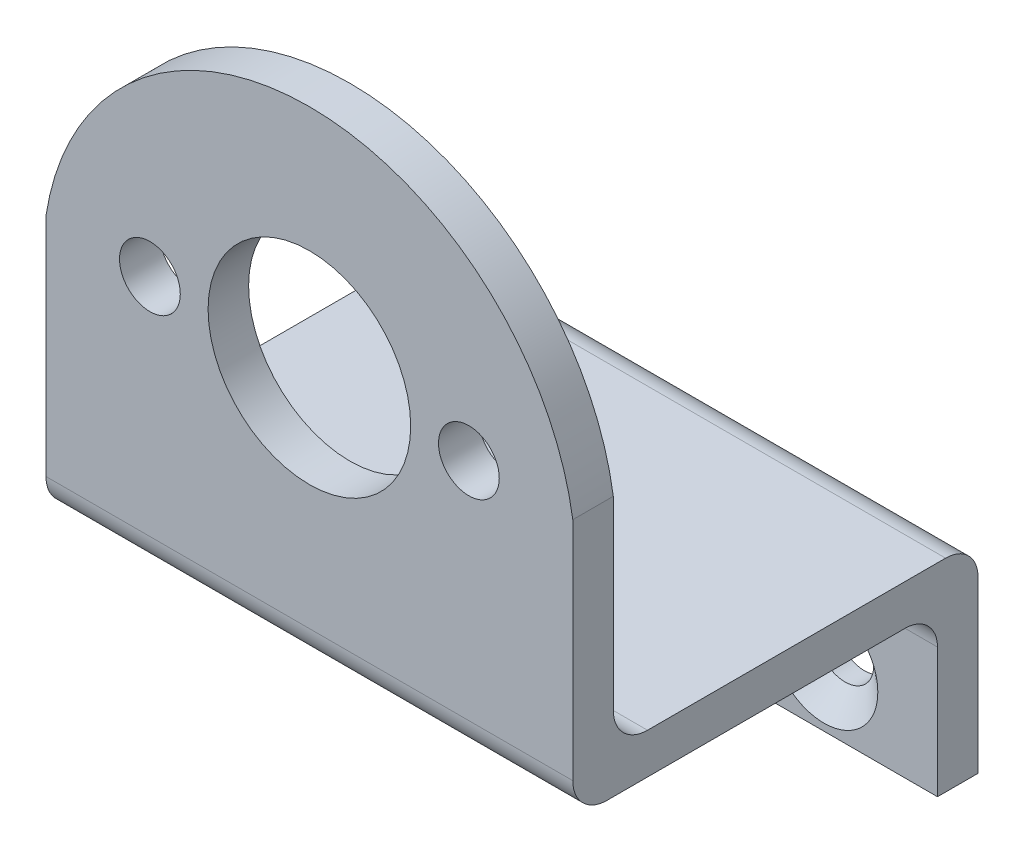
ISO-10303-21;
HEADER;
FILE_DESCRIPTION(('STEP AP214'),'2;1');
FILE_NAME('part.step','',(''),(''),'','','');
FILE_SCHEMA(('AUTOMOTIVE_DESIGN { 1 0 10303 214 1 1 1 1 }'));
ENDSEC;
DATA;
#1=APPLICATION_CONTEXT('core data for automotive mechanical design processes');
#2=APPLICATION_PROTOCOL_DEFINITION('international standard','automotive_design',2000,#1);
#3=PRODUCT_CONTEXT('',#1,'mechanical');
#4=PRODUCT('Part','Part','',(#3));
#5=PRODUCT_RELATED_PRODUCT_CATEGORY('part','',(#4));
#6=PRODUCT_DEFINITION_FORMATION('','',#4);
#7=PRODUCT_DEFINITION_CONTEXT('part definition',#1,'design');
#8=PRODUCT_DEFINITION('design','',#6,#7);
#9=PRODUCT_DEFINITION_SHAPE('','',#8);
#10=(LENGTH_UNIT() NAMED_UNIT(*) SI_UNIT(.MILLI.,.METRE.));
#11=(NAMED_UNIT(*) PLANE_ANGLE_UNIT() SI_UNIT($,.RADIAN.));
#12=(NAMED_UNIT(*) SI_UNIT($,.STERADIAN.) SOLID_ANGLE_UNIT());
#13=UNCERTAINTY_MEASURE_WITH_UNIT(LENGTH_MEASURE(1.E-05),#10,'distance_accuracy_value','');
#14=(GEOMETRIC_REPRESENTATION_CONTEXT(3) GLOBAL_UNCERTAINTY_ASSIGNED_CONTEXT((#13)) GLOBAL_UNIT_ASSIGNED_CONTEXT((#10,
#11,#12)) REPRESENTATION_CONTEXT('',''));
#15=CARTESIAN_POINT('',(0.,0.,0.));
#16=DIRECTION('',(0.,0.,1.));
#17=DIRECTION('',(1.,0.,0.));
#18=AXIS2_PLACEMENT_3D('',#15,#16,#17);
#19=CARTESIAN_POINT('',(41.275,42.094372260743,3.175));
#20=DIRECTION('',(0.,0.,-1.));
#21=DIRECTION('',(0.,1.,0.));
#22=AXIS2_PLACEMENT_3D('',#19,#20,#21);
#23=PLANE('',#22);
#24=CARTESIAN_POINT('',(8.14050126007641,24.314372260743,3.17499999999999));
#25=DIRECTION('',(0.,0.,1.));
#26=DIRECTION('',(1.,0.,0.));
#27=AXIS2_PLACEMENT_3D('',#24,#25,#26);
#28=CIRCLE('',#27,2.38125);
#29=CARTESIAN_POINT('',(10.5217512600764,24.314372260743,3.17499999999999));
#30=VERTEX_POINT('',#29);
#31=EDGE_CURVE('E249',#30,#30,#28,.T.);
#32=ORIENTED_EDGE('',*,*,#31,.F.);
#33=EDGE_LOOP('',(#32));
#34=FACE_BOUND('',#33,.T.);
#35=CARTESIAN_POINT('',(20.6375,24.3848505315544,3.17499999999999));
#36=DIRECTION('',(0.,0.,1.));
#37=DIRECTION('',(1.,0.,0.));
#38=AXIS2_PLACEMENT_3D('',#35,#36,#37);
#39=CIRCLE('',#38,7.9375);
#40=CARTESIAN_POINT('',(28.575,24.3848505315544,3.17499999999999));
#41=VERTEX_POINT('',#40);
#42=EDGE_CURVE('E246',#41,#41,#39,.T.);
#43=ORIENTED_EDGE('',*,*,#42,.F.);
#44=EDGE_LOOP('',(#43));
#45=FACE_BOUND('',#44,.T.);
#46=DIRECTION('',(0.,-1.,0.));
#47=VECTOR('',#46,1.);
#48=CARTESIAN_POINT('',(41.275,42.094372260743,3.175));
#49=LINE('',#48,#47);
#50=CARTESIAN_POINT('',(41.275,24.3848505315544,3.17499999999999));
#51=VERTEX_POINT('',#50);
#52=CARTESIAN_POINT('',(41.275,6.67532880236569,3.17499999999999));
#53=VERTEX_POINT('',#52);
#54=EDGE_CURVE('E146',#51,#53,#49,.T.);
#55=ORIENTED_EDGE('',*,*,#54,.F.);
#56=CARTESIAN_POINT('',(20.6375,21.2148257253978,3.17499999999999));
#57=DIRECTION('',(0.,0.,1.));
#58=DIRECTION('',(1.,0.,0.));
#59=AXIS2_PLACEMENT_3D('',#56,#57,#58);
#60=CIRCLE('',#59,20.8795465353453);
#61=CARTESIAN_POINT('',(0.,24.3848505315544,3.17499999999999));
#62=VERTEX_POINT('',#61);
#63=EDGE_CURVE('E253',#62,#51,#60,.F.);
#64=ORIENTED_EDGE('',*,*,#63,.F.);
#65=DIRECTION('',(0.,-1.,0.));
#66=VECTOR('',#65,1.);
#67=CARTESIAN_POINT('',(0.,42.094372260743,3.175));
#68=LINE('',#67,#66);
#69=CARTESIAN_POINT('',(0.,6.67532880236569,3.17499999999999));
#70=VERTEX_POINT('',#69);
#71=EDGE_CURVE('E201',#62,#70,#68,.T.);
#72=ORIENTED_EDGE('',*,*,#71,.T.);
#73=DIRECTION('',(-1.,0.,0.));
#74=VECTOR('',#73,1.);
#75=CARTESIAN_POINT('',(41.275,6.67532880236569,3.17499999999999));
#76=LINE('',#75,#74);
#77=EDGE_CURVE('E241',#53,#70,#76,.T.);
#78=ORIENTED_EDGE('',*,*,#77,.F.);
#79=EDGE_LOOP('',(#55,#64,#72,#78));
#80=FACE_BOUND('',#79,.T.);
#81=CARTESIAN_POINT('',(33.1341012600764,24.314372260743,3.17499999999999));
#82=DIRECTION('',(0.,0.,1.));
#83=DIRECTION('',(1.,0.,0.));
#84=AXIS2_PLACEMENT_3D('',#81,#82,#83);
#85=CIRCLE('',#84,2.38125);
#86=CARTESIAN_POINT('',(35.5153512600764,24.314372260743,3.17499999999999));
#87=VERTEX_POINT('',#86);
#88=EDGE_CURVE('E255',#87,#87,#85,.T.);
#89=ORIENTED_EDGE('',*,*,#88,.F.);
#90=EDGE_LOOP('',(#89));
#91=FACE_BOUND('',#90,.T.);
#92=ADVANCED_FACE('F75',(#34,#45,#80,#91),#23,.F.);
#93=CARTESIAN_POINT('',(41.275,42.094372260743,0.));
#94=DIRECTION('',(0.,0.,-1.));
#95=DIRECTION('',(0.,1.,0.));
#96=AXIS2_PLACEMENT_3D('',#93,#94,#95);
#97=PLANE('',#96);
#98=CARTESIAN_POINT('',(20.6375,24.3848505315544,0.));
#99=DIRECTION('',(0.,0.,-1.));
#100=DIRECTION('',(0.,1.,0.));
#101=AXIS2_PLACEMENT_3D('',#98,#99,#100);
#102=CIRCLE('',#101,7.9375);
#103=CARTESIAN_POINT('',(20.6375,32.3223505315544,0.));
#104=VERTEX_POINT('',#103);
#105=EDGE_CURVE('E204',#104,#104,#102,.T.);
#106=ORIENTED_EDGE('',*,*,#105,.F.);
#107=EDGE_LOOP('',(#106));
#108=FACE_BOUND('',#107,.T.);
#109=CARTESIAN_POINT('',(20.6375,21.2148257253978,0.));
#110=DIRECTION('',(0.,0.,-1.));
#111=DIRECTION('',(0.,1.,0.));
#112=AXIS2_PLACEMENT_3D('',#109,#110,#111);
#113=CIRCLE('',#112,20.8795465353453);
#114=CARTESIAN_POINT('',(41.275,24.3848505315544,0.));
#115=VERTEX_POINT('',#114);
#116=CARTESIAN_POINT('',(0.,24.3848505315543,0.));
#117=VERTEX_POINT('',#116);
#118=EDGE_CURVE('E90',#115,#117,#113,.F.);
#119=ORIENTED_EDGE('',*,*,#118,.F.);
#120=DIRECTION('',(0.,-1.,0.));
#121=VECTOR('',#120,1.);
#122=CARTESIAN_POINT('',(41.275,42.094372260743,0.));
#123=LINE('',#122,#121);
#124=CARTESIAN_POINT('',(41.275,9.85032880236569,0.));
#125=VERTEX_POINT('',#124);
#126=EDGE_CURVE('E98',#115,#125,#123,.T.);
#127=ORIENTED_EDGE('',*,*,#126,.T.);
#128=DIRECTION('',(-1.,0.,0.));
#129=VECTOR('',#128,1.);
#130=CARTESIAN_POINT('',(41.275,9.85032880236569,0.));
#131=LINE('',#130,#129);
#132=CARTESIAN_POINT('',(0.,9.85032880236569,0.));
#133=VERTEX_POINT('',#132);
#134=EDGE_CURVE('E200',#125,#133,#131,.T.);
#135=ORIENTED_EDGE('',*,*,#134,.T.);
#136=DIRECTION('',(0.,-1.,0.));
#137=VECTOR('',#136,1.);
#138=CARTESIAN_POINT('',(0.,42.094372260743,0.));
#139=LINE('',#138,#137);
#140=EDGE_CURVE('E138',#117,#133,#139,.T.);
#141=ORIENTED_EDGE('',*,*,#140,.F.);
#142=EDGE_LOOP('',(#119,#127,#135,#141));
#143=FACE_BOUND('',#142,.T.);
#144=CARTESIAN_POINT('',(8.14050126007641,24.314372260743,0.));
#145=DIRECTION('',(0.,0.,-1.));
#146=DIRECTION('',(0.,1.,0.));
#147=AXIS2_PLACEMENT_3D('',#144,#145,#146);
#148=CIRCLE('',#147,2.38125);
#149=CARTESIAN_POINT('',(8.14050126007641,26.695622260743,0.));
#150=VERTEX_POINT('',#149);
#151=EDGE_CURVE('E247',#150,#150,#148,.T.);
#152=ORIENTED_EDGE('',*,*,#151,.F.);
#153=EDGE_LOOP('',(#152));
#154=FACE_BOUND('',#153,.T.);
#155=CARTESIAN_POINT('',(33.1341012600764,24.314372260743,0.));
#156=DIRECTION('',(0.,0.,-1.));
#157=DIRECTION('',(0.,1.,0.));
#158=AXIS2_PLACEMENT_3D('',#155,#156,#157);
#159=CIRCLE('',#158,2.38125);
#160=CARTESIAN_POINT('',(33.1341012600764,26.695622260743,0.));
#161=VERTEX_POINT('',#160);
#162=EDGE_CURVE('E78',#161,#161,#159,.T.);
#163=ORIENTED_EDGE('',*,*,#162,.F.);
#164=EDGE_LOOP('',(#163));
#165=FACE_BOUND('',#164,.T.);
#166=ADVANCED_FACE('F329',(#108,#143,#154,#165),#97,.T.);
#167=CARTESIAN_POINT('',(41.275,6.67532880236569,0.494043458377321));
#168=DIRECTION('',(-1.,0.,0.));
#169=DIRECTION('',(0.,0.,1.));
#170=AXIS2_PLACEMENT_3D('',#167,#168,#169);
#171=CYLINDRICAL_SURFACE('',#170,2.68095654162267);
#172=CARTESIAN_POINT('',(0.,6.67532880236569,0.494043458377321));
#173=DIRECTION('',(1.,0.,0.));
#174=DIRECTION('',(0.,0.,-1.));
#175=AXIS2_PLACEMENT_3D('',#172,#173,#174);
#176=CIRCLE('',#175,2.68095654162267);
#177=CARTESIAN_POINT('',(0.,3.99437226074302,0.494043458377321));
#178=VERTEX_POINT('',#177);
#179=EDGE_CURVE('E203',#70,#178,#176,.T.);
#180=ORIENTED_EDGE('',*,*,#179,.T.);
#181=DIRECTION('',(-1.,0.,0.));
#182=VECTOR('',#181,1.);
#183=CARTESIAN_POINT('',(41.275,3.99437226074302,0.494043458377321));
#184=LINE('',#183,#182);
#185=CARTESIAN_POINT('',(41.275,3.99437226074302,0.494043458377321));
#186=VERTEX_POINT('',#185);
#187=EDGE_CURVE('E238',#186,#178,#184,.T.);
#188=ORIENTED_EDGE('',*,*,#187,.F.);
#189=CARTESIAN_POINT('',(41.275,6.67532880236569,0.494043458377321));
#190=DIRECTION('',(1.,0.,0.));
#191=DIRECTION('',(0.,0.,-1.));
#192=AXIS2_PLACEMENT_3D('',#189,#190,#191);
#193=CIRCLE('',#192,2.68095654162267);
#194=EDGE_CURVE('E270',#53,#186,#193,.T.);
#195=ORIENTED_EDGE('',*,*,#194,.F.);
#196=ORIENTED_EDGE('',*,*,#77,.T.);
#197=EDGE_LOOP('',(#180,#188,#195,#196));
#198=FACE_BOUND('',#197,.T.);
#199=ADVANCED_FACE('F302',(#198),#171,.T.);
#200=CARTESIAN_POINT('',(41.275,3.99437226074302,0.494043458377321));
#201=DIRECTION('',(0.,1.,0.));
#202=DIRECTION('',(0.,0.,1.));
#203=AXIS2_PLACEMENT_3D('',#200,#201,#202);
#204=PLANE('',#203);
#205=DIRECTION('',(0.,0.,-1.));
#206=VECTOR('',#205,1.);
#207=CARTESIAN_POINT('',(0.,3.99437226074302,0.494043458377321));
#208=LINE('',#207,#206);
#209=CARTESIAN_POINT('',(0.,3.99437226074302,-22.86));
#210=VERTEX_POINT('',#209);
#211=EDGE_CURVE('E206',#178,#210,#208,.T.);
#212=ORIENTED_EDGE('',*,*,#211,.T.);
#213=DIRECTION('',(-1.,0.,0.));
#214=VECTOR('',#213,1.);
#215=CARTESIAN_POINT('',(41.275,3.99437226074302,-22.86));
#216=LINE('',#215,#214);
#217=CARTESIAN_POINT('',(41.275,3.99437226074302,-22.86));
#218=VERTEX_POINT('',#217);
#219=EDGE_CURVE('E235',#218,#210,#216,.T.);
#220=ORIENTED_EDGE('',*,*,#219,.F.);
#221=DIRECTION('',(0.,0.,-1.));
#222=VECTOR('',#221,1.);
#223=CARTESIAN_POINT('',(41.275,3.99437226074302,0.494043458377321));
#224=LINE('',#223,#222);
#225=EDGE_CURVE('E272',#186,#218,#224,.T.);
#226=ORIENTED_EDGE('',*,*,#225,.F.);
#227=ORIENTED_EDGE('',*,*,#187,.T.);
#228=EDGE_LOOP('',(#212,#220,#226,#227));
#229=FACE_BOUND('',#228,.T.);
#230=ADVANCED_FACE('F306',(#229),#204,.F.);
#231=CARTESIAN_POINT('',(41.275,1.45437226074302,-22.86));
#232=DIRECTION('',(-1.,0.,0.));
#233=DIRECTION('',(0.,0.,1.));
#234=AXIS2_PLACEMENT_3D('',#231,#232,#233);
#235=CYLINDRICAL_SURFACE('',#234,2.54);
#236=CARTESIAN_POINT('',(0.,1.45437226074302,-22.86));
#237=DIRECTION('',(-1.,0.,0.));
#238=DIRECTION('',(0.,0.,1.));
#239=AXIS2_PLACEMENT_3D('',#236,#237,#238);
#240=CIRCLE('',#239,2.54);
#241=CARTESIAN_POINT('',(0.,1.45437226074302,-25.4));
#242=VERTEX_POINT('',#241);
#243=EDGE_CURVE('E208',#210,#242,#240,.T.);
#244=ORIENTED_EDGE('',*,*,#243,.T.);
#245=DIRECTION('',(-1.,0.,0.));
#246=VECTOR('',#245,1.);
#247=CARTESIAN_POINT('',(41.275,1.45437226074302,-25.4));
#248=LINE('',#247,#246);
#249=CARTESIAN_POINT('',(41.275,1.45437226074302,-25.4));
#250=VERTEX_POINT('',#249);
#251=EDGE_CURVE('E233',#250,#242,#248,.T.);
#252=ORIENTED_EDGE('',*,*,#251,.F.);
#253=CARTESIAN_POINT('',(41.275,1.45437226074302,-22.86));
#254=DIRECTION('',(-1.,0.,0.));
#255=DIRECTION('',(0.,0.,1.));
#256=AXIS2_PLACEMENT_3D('',#253,#254,#255);
#257=CIRCLE('',#256,2.54);
#258=EDGE_CURVE('E274',#218,#250,#257,.T.);
#259=ORIENTED_EDGE('',*,*,#258,.F.);
#260=ORIENTED_EDGE('',*,*,#219,.T.);
#261=EDGE_LOOP('',(#244,#252,#259,#260));
#262=FACE_BOUND('',#261,.T.);
#263=ADVANCED_FACE('F312',(#262),#235,.F.);
#264=CARTESIAN_POINT('',(41.275,-8.70562773925698,-25.4));
#265=DIRECTION('',(0.,0.,1.));
#266=DIRECTION('',(0.,-1.,0.));
#267=AXIS2_PLACEMENT_3D('',#264,#265,#266);
#268=PLANE('',#267);
#269=CARTESIAN_POINT('',(8.89,-3.94312773925698,-25.4));
#270=DIRECTION('',(0.,0.,1.));
#271=DIRECTION('',(1.,0.,0.));
#272=AXIS2_PLACEMENT_3D('',#269,#270,#271);
#273=CIRCLE('',#272,4.2164);
#274=CARTESIAN_POINT('',(13.1064,-3.94312773925698,-25.4));
#275=VERTEX_POINT('',#274);
#276=EDGE_CURVE('E468',#275,#275,#273,.T.);
#277=ORIENTED_EDGE('',*,*,#276,.F.);
#278=EDGE_LOOP('',(#277));
#279=FACE_BOUND('',#278,.T.);
#280=CARTESIAN_POINT('',(32.385,-3.94312773925698,-25.4));
#281=DIRECTION('',(0.,0.,1.));
#282=DIRECTION('',(1.,0.,0.));
#283=AXIS2_PLACEMENT_3D('',#280,#281,#282);
#284=CIRCLE('',#283,4.2164);
#285=CARTESIAN_POINT('',(36.6014,-3.94312773925698,-25.4));
#286=VERTEX_POINT('',#285);
#287=EDGE_CURVE('E475',#286,#286,#284,.T.);
#288=ORIENTED_EDGE('',*,*,#287,.F.);
#289=EDGE_LOOP('',(#288));
#290=FACE_BOUND('',#289,.T.);
#291=DIRECTION('',(0.,1.,0.));
#292=VECTOR('',#291,1.);
#293=CARTESIAN_POINT('',(0.,-8.70562773925698,-25.4));
#294=LINE('',#293,#292);
#295=CARTESIAN_POINT('',(0.,-8.70562773925698,-25.4));
#296=VERTEX_POINT('',#295);
#297=EDGE_CURVE('E211',#296,#242,#294,.T.);
#298=ORIENTED_EDGE('',*,*,#297,.F.);
#299=DIRECTION('',(-1.,0.,0.));
#300=VECTOR('',#299,1.);
#301=CARTESIAN_POINT('',(41.275,-8.70562773925698,-25.4));
#302=LINE('',#301,#300);
#303=CARTESIAN_POINT('',(41.275,-8.70562773925698,-25.4));
#304=VERTEX_POINT('',#303);
#305=EDGE_CURVE('E231',#304,#296,#302,.T.);
#306=ORIENTED_EDGE('',*,*,#305,.F.);
#307=DIRECTION('',(0.,1.,0.));
#308=VECTOR('',#307,1.);
#309=CARTESIAN_POINT('',(41.275,-8.70562773925698,-25.4));
#310=LINE('',#309,#308);
#311=EDGE_CURVE('E276',#304,#250,#310,.T.);
#312=ORIENTED_EDGE('',*,*,#311,.T.);
#313=ORIENTED_EDGE('',*,*,#251,.T.);
#314=EDGE_LOOP('',(#298,#306,#312,#313));
#315=FACE_BOUND('',#314,.T.);
#316=ADVANCED_FACE('F315',(#279,#290,#315),#268,.T.);
#317=CARTESIAN_POINT('',(41.275,-8.70562773925698,-28.575));
#318=DIRECTION('',(0.,-1.,0.));
#319=DIRECTION('',(0.,0.,-1.));
#320=AXIS2_PLACEMENT_3D('',#317,#318,#319);
#321=PLANE('',#320);
#322=DIRECTION('',(0.,0.,1.));
#323=VECTOR('',#322,1.);
#324=CARTESIAN_POINT('',(0.,-8.70562773925698,-28.575));
#325=LINE('',#324,#323);
#326=CARTESIAN_POINT('',(0.,-8.70562773925698,-28.575));
#327=VERTEX_POINT('',#326);
#328=EDGE_CURVE('E214',#327,#296,#325,.T.);
#329=ORIENTED_EDGE('',*,*,#328,.F.);
#330=DIRECTION('',(-1.,0.,0.));
#331=VECTOR('',#330,1.);
#332=CARTESIAN_POINT('',(41.275,-8.70562773925698,-28.575));
#333=LINE('',#332,#331);
#334=CARTESIAN_POINT('',(41.275,-8.70562773925698,-28.575));
#335=VERTEX_POINT('',#334);
#336=EDGE_CURVE('E229',#335,#327,#333,.T.);
#337=ORIENTED_EDGE('',*,*,#336,.F.);
#338=DIRECTION('',(0.,0.,1.));
#339=VECTOR('',#338,1.);
#340=CARTESIAN_POINT('',(41.275,-8.70562773925698,-28.575));
#341=LINE('',#340,#339);
#342=EDGE_CURVE('E279',#335,#304,#341,.T.);
#343=ORIENTED_EDGE('',*,*,#342,.T.);
#344=ORIENTED_EDGE('',*,*,#305,.T.);
#345=EDGE_LOOP('',(#329,#337,#343,#344));
#346=FACE_BOUND('',#345,.T.);
#347=ADVANCED_FACE('F317',(#346),#321,.T.);
#348=CARTESIAN_POINT('',(41.275,4.62937226074302,-28.575));
#349=DIRECTION('',(0.,0.,-1.));
#350=DIRECTION('',(0.,1.,0.));
#351=AXIS2_PLACEMENT_3D('',#348,#349,#350);
#352=PLANE('',#351);
#353=CARTESIAN_POINT('',(8.89,-3.94312773925698,-28.575));
#354=DIRECTION('',(0.,0.,1.));
#355=DIRECTION('',(1.,0.,0.));
#356=AXIS2_PLACEMENT_3D('',#353,#354,#355);
#357=CIRCLE('',#356,2.2479);
#358=CARTESIAN_POINT('',(11.1379,-3.94312773925698,-28.575));
#359=VERTEX_POINT('',#358);
#360=EDGE_CURVE('E470',#359,#359,#357,.T.);
#361=ORIENTED_EDGE('',*,*,#360,.T.);
#362=EDGE_LOOP('',(#361));
#363=FACE_BOUND('',#362,.T.);
#364=CARTESIAN_POINT('',(32.385,-3.94312773925698,-28.575));
#365=DIRECTION('',(0.,0.,1.));
#366=DIRECTION('',(1.,0.,0.));
#367=AXIS2_PLACEMENT_3D('',#364,#365,#366);
#368=CIRCLE('',#367,2.2479);
#369=CARTESIAN_POINT('',(34.6329,-3.94312773925698,-28.575));
#370=VERTEX_POINT('',#369);
#371=EDGE_CURVE('E260',#370,#370,#368,.T.);
#372=ORIENTED_EDGE('',*,*,#371,.T.);
#373=EDGE_LOOP('',(#372));
#374=FACE_BOUND('',#373,.T.);
#375=DIRECTION('',(0.,-1.,0.));
#376=VECTOR('',#375,1.);
#377=CARTESIAN_POINT('',(0.,4.62937226074302,-28.575));
#378=LINE('',#377,#376);
#379=CARTESIAN_POINT('',(0.,4.62937226074302,-28.575));
#380=VERTEX_POINT('',#379);
#381=EDGE_CURVE('E217',#380,#327,#378,.T.);
#382=ORIENTED_EDGE('',*,*,#381,.F.);
#383=DIRECTION('',(-1.,0.,0.));
#384=VECTOR('',#383,1.);
#385=CARTESIAN_POINT('',(41.275,4.62937226074302,-28.575));
#386=LINE('',#385,#384);
#387=CARTESIAN_POINT('',(41.275,4.62937226074302,-28.575));
#388=VERTEX_POINT('',#387);
#389=EDGE_CURVE('E180',#388,#380,#386,.T.);
#390=ORIENTED_EDGE('',*,*,#389,.F.);
#391=DIRECTION('',(0.,-1.,0.));
#392=VECTOR('',#391,1.);
#393=CARTESIAN_POINT('',(41.275,4.62937226074302,-28.575));
#394=LINE('',#393,#392);
#395=EDGE_CURVE('E191',#388,#335,#394,.T.);
#396=ORIENTED_EDGE('',*,*,#395,.T.);
#397=ORIENTED_EDGE('',*,*,#336,.T.);
#398=EDGE_LOOP('',(#382,#390,#396,#397));
#399=FACE_BOUND('',#398,.T.);
#400=ADVANCED_FACE('F283',(#363,#374,#399),#352,.T.);
#401=CARTESIAN_POINT('',(41.275,4.62937226074302,-26.035));
#402=DIRECTION('',(-1.,0.,0.));
#403=DIRECTION('',(0.,0.,1.));
#404=AXIS2_PLACEMENT_3D('',#401,#402,#403);
#405=CYLINDRICAL_SURFACE('',#404,2.54);
#406=CARTESIAN_POINT('',(0.,4.62937226074302,-26.035));
#407=DIRECTION('',(-1.,0.,0.));
#408=DIRECTION('',(0.,0.,1.));
#409=AXIS2_PLACEMENT_3D('',#406,#407,#408);
#410=CIRCLE('',#409,2.54);
#411=CARTESIAN_POINT('',(0.,7.16937226074302,-26.035));
#412=VERTEX_POINT('',#411);
#413=EDGE_CURVE('E175',#412,#380,#410,.T.);
#414=ORIENTED_EDGE('',*,*,#413,.F.);
#415=DIRECTION('',(-1.,0.,0.));
#416=VECTOR('',#415,1.);
#417=CARTESIAN_POINT('',(41.275,7.16937226074302,-26.035));
#418=LINE('',#417,#416);
#419=CARTESIAN_POINT('',(41.275,7.16937226074302,-26.035));
#420=VERTEX_POINT('',#419);
#421=EDGE_CURVE('E170',#420,#412,#418,.T.);
#422=ORIENTED_EDGE('',*,*,#421,.F.);
#423=CARTESIAN_POINT('',(41.275,4.62937226074302,-26.035));
#424=DIRECTION('',(-1.,0.,0.));
#425=DIRECTION('',(0.,0.,1.));
#426=AXIS2_PLACEMENT_3D('',#423,#424,#425);
#427=CIRCLE('',#426,2.54);
#428=EDGE_CURVE('E173',#420,#388,#427,.T.);
#429=ORIENTED_EDGE('',*,*,#428,.T.);
#430=ORIENTED_EDGE('',*,*,#389,.T.);
#431=EDGE_LOOP('',(#414,#422,#429,#430));
#432=FACE_BOUND('',#431,.T.);
#433=ADVANCED_FACE('F172',(#432),#405,.T.);
#434=CARTESIAN_POINT('',(41.275,7.16937226074302,-2.68095654162268));
#435=DIRECTION('',(0.,1.,0.));
#436=DIRECTION('',(0.,0.,1.));
#437=AXIS2_PLACEMENT_3D('',#434,#435,#436);
#438=PLANE('',#437);
#439=DIRECTION('',(0.,0.,-1.));
#440=VECTOR('',#439,1.);
#441=CARTESIAN_POINT('',(0.,7.16937226074302,-2.68095654162268));
#442=LINE('',#441,#440);
#443=CARTESIAN_POINT('',(0.,7.16937226074302,-2.68095654162268));
#444=VERTEX_POINT('',#443);
#445=EDGE_CURVE('E221',#444,#412,#442,.T.);
#446=ORIENTED_EDGE('',*,*,#445,.F.);
#447=DIRECTION('',(-1.,0.,0.));
#448=VECTOR('',#447,1.);
#449=CARTESIAN_POINT('',(41.275,7.16937226074302,-2.68095654162268));
#450=LINE('',#449,#448);
#451=CARTESIAN_POINT('',(41.275,7.16937226074302,-2.68095654162268));
#452=VERTEX_POINT('',#451);
#453=EDGE_CURVE('E181',#452,#444,#450,.T.);
#454=ORIENTED_EDGE('',*,*,#453,.F.);
#455=DIRECTION('',(0.,0.,-1.));
#456=VECTOR('',#455,1.);
#457=CARTESIAN_POINT('',(41.275,7.16937226074302,-2.68095654162268));
#458=LINE('',#457,#456);
#459=EDGE_CURVE('E187',#452,#420,#458,.T.);
#460=ORIENTED_EDGE('',*,*,#459,.T.);
#461=ORIENTED_EDGE('',*,*,#421,.T.);
#462=EDGE_LOOP('',(#446,#454,#460,#461));
#463=FACE_BOUND('',#462,.T.);
#464=ADVANCED_FACE('F193',(#463),#438,.T.);
#465=CARTESIAN_POINT('',(41.275,9.85032880236569,-2.68095654162268));
#466=DIRECTION('',(-1.,0.,0.));
#467=DIRECTION('',(0.,0.,1.));
#468=AXIS2_PLACEMENT_3D('',#465,#466,#467);
#469=CYLINDRICAL_SURFACE('',#468,2.68095654162267);
#470=CARTESIAN_POINT('',(0.,9.85032880236569,-2.68095654162268));
#471=DIRECTION('',(1.,0.,0.));
#472=DIRECTION('',(0.,0.,-1.));
#473=AXIS2_PLACEMENT_3D('',#470,#471,#472);
#474=CIRCLE('',#473,2.68095654162267);
#475=EDGE_CURVE('E223',#133,#444,#474,.T.);
#476=ORIENTED_EDGE('',*,*,#475,.F.);
#477=ORIENTED_EDGE('',*,*,#134,.F.);
#478=CARTESIAN_POINT('',(41.275,9.85032880236569,-2.68095654162268));
#479=DIRECTION('',(1.,0.,0.));
#480=DIRECTION('',(0.,0.,-1.));
#481=AXIS2_PLACEMENT_3D('',#478,#479,#480);
#482=CIRCLE('',#481,2.68095654162267);
#483=EDGE_CURVE('E194',#125,#452,#482,.T.);
#484=ORIENTED_EDGE('',*,*,#483,.T.);
#485=ORIENTED_EDGE('',*,*,#453,.T.);
#486=EDGE_LOOP('',(#476,#477,#484,#485));
#487=FACE_BOUND('',#486,.T.);
#488=ADVANCED_FACE('F289',(#487),#469,.F.);
#489=CARTESIAN_POINT('',(41.275,6.67532880236569,0.494043458377321));
#490=DIRECTION('',(1.,0.,0.));
#491=DIRECTION('',(0.,0.,-1.));
#492=AXIS2_PLACEMENT_3D('',#489,#490,#491);
#493=PLANE('',#492);
#494=DIRECTION('',(0.,0.,1.));
#495=VECTOR('',#494,1.);
#496=CARTESIAN_POINT('',(41.275,24.3848505315543,-28.575));
#497=LINE('',#496,#495);
#498=EDGE_CURVE('E12',#51,#115,#497,.F.);
#499=ORIENTED_EDGE('',*,*,#498,.F.);
#500=ORIENTED_EDGE('',*,*,#54,.T.);
#501=ORIENTED_EDGE('',*,*,#194,.T.);
#502=ORIENTED_EDGE('',*,*,#225,.T.);
#503=ORIENTED_EDGE('',*,*,#258,.T.);
#504=ORIENTED_EDGE('',*,*,#311,.F.);
#505=ORIENTED_EDGE('',*,*,#342,.F.);
#506=ORIENTED_EDGE('',*,*,#395,.F.);
#507=ORIENTED_EDGE('',*,*,#428,.F.);
#508=ORIENTED_EDGE('',*,*,#459,.F.);
#509=ORIENTED_EDGE('',*,*,#483,.F.);
#510=ORIENTED_EDGE('',*,*,#126,.F.);
#511=EDGE_LOOP('',(#499,#500,#501,#502,#503,#504,#505,#506,#507,#508,#509,#510));
#512=FACE_BOUND('',#511,.T.);
#513=ADVANCED_FACE('F185',(#512),#493,.T.);
#514=CARTESIAN_POINT('',(0.,6.67532880236569,0.494043458377321));
#515=DIRECTION('',(1.,0.,0.));
#516=DIRECTION('',(0.,0.,-1.));
#517=AXIS2_PLACEMENT_3D('',#514,#515,#516);
#518=PLANE('',#517);
#519=ORIENTED_EDGE('',*,*,#71,.F.);
#520=DIRECTION('',(0.,0.,1.));
#521=VECTOR('',#520,1.);
#522=CARTESIAN_POINT('',(0.,24.3848505315543,-28.575));
#523=LINE('',#522,#521);
#524=EDGE_CURVE('E83',#62,#117,#523,.F.);
#525=ORIENTED_EDGE('',*,*,#524,.T.);
#526=ORIENTED_EDGE('',*,*,#140,.T.);
#527=ORIENTED_EDGE('',*,*,#475,.T.);
#528=ORIENTED_EDGE('',*,*,#445,.T.);
#529=ORIENTED_EDGE('',*,*,#413,.T.);
#530=ORIENTED_EDGE('',*,*,#381,.T.);
#531=ORIENTED_EDGE('',*,*,#328,.T.);
#532=ORIENTED_EDGE('',*,*,#297,.T.);
#533=ORIENTED_EDGE('',*,*,#243,.F.);
#534=ORIENTED_EDGE('',*,*,#211,.F.);
#535=ORIENTED_EDGE('',*,*,#179,.F.);
#536=EDGE_LOOP('',(#519,#525,#526,#527,#528,#529,#530,#531,#532,#533,#534,#535));
#537=FACE_BOUND('',#536,.T.);
#538=ADVANCED_FACE('F286',(#537),#518,.F.);
#539=CARTESIAN_POINT('',(20.6375,24.3848505315544,-3.17500000000001));
#540=DIRECTION('',(0.,0.,1.));
#541=DIRECTION('',(1.,0.,0.));
#542=AXIS2_PLACEMENT_3D('',#539,#540,#541);
#543=CYLINDRICAL_SURFACE('',#542,7.9375);
#544=ORIENTED_EDGE('',*,*,#105,.T.);
#545=EDGE_LOOP('',(#544));
#546=FACE_BOUND('',#545,.T.);
#547=ORIENTED_EDGE('',*,*,#42,.T.);
#548=EDGE_LOOP('',(#547));
#549=FACE_BOUND('',#548,.T.);
#550=ADVANCED_FACE('F339',(#546,#549),#543,.F.);
#551=CARTESIAN_POINT('',(20.6375,21.2148257253978,-28.575));
#552=DIRECTION('',(0.,0.,1.));
#553=DIRECTION('',(1.,0.,0.));
#554=AXIS2_PLACEMENT_3D('',#551,#552,#553);
#555=CYLINDRICAL_SURFACE('',#554,20.8795465353453);
#556=ORIENTED_EDGE('',*,*,#118,.T.);
#557=ORIENTED_EDGE('',*,*,#524,.F.);
#558=ORIENTED_EDGE('',*,*,#63,.T.);
#559=ORIENTED_EDGE('',*,*,#498,.T.);
#560=EDGE_LOOP('',(#556,#557,#558,#559));
#561=FACE_BOUND('',#560,.T.);
#562=ADVANCED_FACE('F294',(#561),#555,.T.);
#563=CARTESIAN_POINT('',(8.14050126007641,24.314372260743,-28.575));
#564=DIRECTION('',(0.,0.,1.));
#565=DIRECTION('',(1.,0.,0.));
#566=AXIS2_PLACEMENT_3D('',#563,#564,#565);
#567=CYLINDRICAL_SURFACE('',#566,2.38125);
#568=ORIENTED_EDGE('',*,*,#151,.T.);
#569=EDGE_LOOP('',(#568));
#570=FACE_BOUND('',#569,.T.);
#571=ORIENTED_EDGE('',*,*,#31,.T.);
#572=EDGE_LOOP('',(#571));
#573=FACE_BOUND('',#572,.T.);
#574=ADVANCED_FACE('F347',(#570,#573),#567,.F.);
#575=CARTESIAN_POINT('',(33.1341012600764,24.314372260743,-28.575));
#576=DIRECTION('',(0.,0.,1.));
#577=DIRECTION('',(1.,0.,0.));
#578=AXIS2_PLACEMENT_3D('',#575,#576,#577);
#579=CYLINDRICAL_SURFACE('',#578,2.38125);
#580=ORIENTED_EDGE('',*,*,#162,.T.);
#581=EDGE_LOOP('',(#580));
#582=FACE_BOUND('',#581,.T.);
#583=ORIENTED_EDGE('',*,*,#88,.T.);
#584=EDGE_LOOP('',(#583));
#585=FACE_BOUND('',#584,.T.);
#586=ADVANCED_FACE('F397',(#582,#585),#579,.F.);
#587=CARTESIAN_POINT('',(32.385,-3.94312773925698,-25.4));
#588=DIRECTION('',(0.,0.,1.));
#589=DIRECTION('',(1.,0.,0.));
#590=AXIS2_PLACEMENT_3D('',#587,#588,#589);
#591=CYLINDRICAL_SURFACE('',#590,2.24789999999999);
#592=ORIENTED_EDGE('',*,*,#371,.F.);
#593=EDGE_LOOP('',(#592));
#594=FACE_BOUND('',#593,.T.);
#595=CARTESIAN_POINT('',(32.385,-3.94312773925698,-27.0517676239725));
#596=DIRECTION('',(0.,0.,1.));
#597=DIRECTION('',(1.,0.,0.));
#598=AXIS2_PLACEMENT_3D('',#595,#596,#597);
#599=CIRCLE('',#598,2.24789999999998);
#600=CARTESIAN_POINT('',(34.6329,-3.94312773925698,-27.0517676239725));
#601=VERTEX_POINT('',#600);
#602=EDGE_CURVE('E478',#601,#601,#599,.T.);
#603=ORIENTED_EDGE('',*,*,#602,.T.);
#604=EDGE_LOOP('',(#603));
#605=FACE_BOUND('',#604,.T.);
#606=ADVANCED_FACE('F405',(#594,#605),#591,.F.);
#607=CARTESIAN_POINT('',(32.385,-3.94312773925698,-25.4));
#608=DIRECTION('',(0.,0.,1.));
#609=DIRECTION('',(1.,0.,0.));
#610=AXIS2_PLACEMENT_3D('',#607,#608,#609);
#611=CONICAL_SURFACE('',#610,4.2164,0.87266462599717);
#612=ORIENTED_EDGE('',*,*,#602,.F.);
#613=EDGE_LOOP('',(#612));
#614=FACE_BOUND('',#613,.T.);
#615=ORIENTED_EDGE('',*,*,#287,.T.);
#616=EDGE_LOOP('',(#615));
#617=FACE_BOUND('',#616,.T.);
#618=ADVANCED_FACE('F428',(#614,#617),#611,.F.);
#619=CARTESIAN_POINT('',(8.89,-3.94312773925698,-25.4));
#620=DIRECTION('',(0.,0.,1.));
#621=DIRECTION('',(1.,0.,0.));
#622=AXIS2_PLACEMENT_3D('',#619,#620,#621);
#623=CYLINDRICAL_SURFACE('',#622,2.24789999999999);
#624=ORIENTED_EDGE('',*,*,#360,.F.);
#625=EDGE_LOOP('',(#624));
#626=FACE_BOUND('',#625,.T.);
#627=CARTESIAN_POINT('',(8.89,-3.94312773925698,-27.0517676239725));
#628=DIRECTION('',(0.,0.,1.));
#629=DIRECTION('',(1.,0.,0.));
#630=AXIS2_PLACEMENT_3D('',#627,#628,#629);
#631=CIRCLE('',#630,2.24789999999999);
#632=CARTESIAN_POINT('',(11.1379,-3.94312773925698,-27.0517676239725));
#633=VERTEX_POINT('',#632);
#634=EDGE_CURVE('E465',#633,#633,#631,.T.);
#635=ORIENTED_EDGE('',*,*,#634,.T.);
#636=EDGE_LOOP('',(#635));
#637=FACE_BOUND('',#636,.T.);
#638=ADVANCED_FACE('F438',(#626,#637),#623,.F.);
#639=CARTESIAN_POINT('',(8.89,-3.94312773925698,-25.4));
#640=DIRECTION('',(0.,0.,1.));
#641=DIRECTION('',(1.,0.,0.));
#642=AXIS2_PLACEMENT_3D('',#639,#640,#641);
#643=CONICAL_SURFACE('',#642,4.2164,0.872664625997169);
#644=ORIENTED_EDGE('',*,*,#634,.F.);
#645=EDGE_LOOP('',(#644));
#646=FACE_BOUND('',#645,.T.);
#647=ORIENTED_EDGE('',*,*,#276,.T.);
#648=EDGE_LOOP('',(#647));
#649=FACE_BOUND('',#648,.T.);
#650=ADVANCED_FACE('F448',(#646,#649),#643,.F.);
#651=CLOSED_SHELL('',(#92,#166,#199,#230,#263,#316,#347,#400,#433,#464,#488,#513,#538,#550,#562,
#574,#586,#606,#618,#638,#650));
#652=MANIFOLD_SOLID_BREP('B2',#651);
#653=ADVANCED_BREP_SHAPE_REPRESENTATION('',(#18,#652),#14);
#654=SHAPE_DEFINITION_REPRESENTATION(#9,#653);
ENDSEC;
END-ISO-10303-21;
